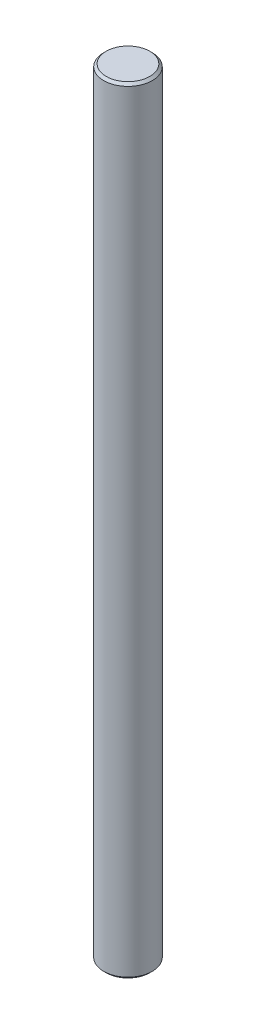
ISO-10303-21;
HEADER;
FILE_DESCRIPTION(('STEP AP214'),'2;1');
FILE_NAME('part.step','',(''),(''),'','','');
FILE_SCHEMA(('AUTOMOTIVE_DESIGN { 1 0 10303 214 1 1 1 1 }'));
ENDSEC;
DATA;
#1=APPLICATION_CONTEXT('core data for automotive mechanical design processes');
#2=APPLICATION_PROTOCOL_DEFINITION('international standard','automotive_design',2000,#1);
#3=PRODUCT_CONTEXT('',#1,'mechanical');
#4=PRODUCT('Part','Part','',(#3));
#5=PRODUCT_RELATED_PRODUCT_CATEGORY('part','',(#4));
#6=PRODUCT_DEFINITION_FORMATION('','',#4);
#7=PRODUCT_DEFINITION_CONTEXT('part definition',#1,'design');
#8=PRODUCT_DEFINITION('design','',#6,#7);
#9=PRODUCT_DEFINITION_SHAPE('','',#8);
#10=(LENGTH_UNIT() NAMED_UNIT(*) SI_UNIT(.MILLI.,.METRE.));
#11=(NAMED_UNIT(*) PLANE_ANGLE_UNIT() SI_UNIT($,.RADIAN.));
#12=(NAMED_UNIT(*) SI_UNIT($,.STERADIAN.) SOLID_ANGLE_UNIT());
#13=UNCERTAINTY_MEASURE_WITH_UNIT(LENGTH_MEASURE(1.E-05),#10,'distance_accuracy_value','');
#14=(GEOMETRIC_REPRESENTATION_CONTEXT(3) GLOBAL_UNCERTAINTY_ASSIGNED_CONTEXT((#13)) GLOBAL_UNIT_ASSIGNED_CONTEXT((#10,
#11,#12)) REPRESENTATION_CONTEXT('',''));
#15=CARTESIAN_POINT('',(0.,0.,0.));
#16=DIRECTION('',(0.,0.,1.));
#17=DIRECTION('',(1.,0.,0.));
#18=AXIS2_PLACEMENT_3D('',#15,#16,#17);
#19=CARTESIAN_POINT('',(0.,40.,0.));
#20=DIRECTION('',(0.,-1.,0.));
#21=DIRECTION('',(0.,0.,-1.));
#22=AXIS2_PLACEMENT_3D('',#19,#20,#21);
#23=CYLINDRICAL_SURFACE('',#22,2.5);
#24=CARTESIAN_POINT('',(0.,-39.75,0.));
#25=DIRECTION('',(0.,1.,0.));
#26=DIRECTION('',(0.,0.,1.));
#27=AXIS2_PLACEMENT_3D('',#24,#25,#26);
#28=CIRCLE('',#27,2.5);
#29=CARTESIAN_POINT('',(0.,-39.75,2.5));
#30=VERTEX_POINT('',#29);
#31=EDGE_CURVE('E48',#30,#30,#28,.T.);
#32=ORIENTED_EDGE('',*,*,#31,.T.);
#33=EDGE_LOOP('',(#32));
#34=FACE_BOUND('',#33,.T.);
#35=CARTESIAN_POINT('',(0.,39.75,0.));
#36=DIRECTION('',(0.,1.,0.));
#37=DIRECTION('',(0.,0.,1.));
#38=AXIS2_PLACEMENT_3D('',#35,#36,#37);
#39=CIRCLE('',#38,2.5);
#40=CARTESIAN_POINT('',(0.,39.75,2.5));
#41=VERTEX_POINT('',#40);
#42=EDGE_CURVE('E52',#41,#41,#39,.F.);
#43=ORIENTED_EDGE('',*,*,#42,.T.);
#44=EDGE_LOOP('',(#43));
#45=FACE_BOUND('',#44,.T.);
#46=ADVANCED_FACE('F36',(#34,#45),#23,.T.);
#47=CARTESIAN_POINT('',(0.,40.,0.));
#48=DIRECTION('',(0.,1.,0.));
#49=DIRECTION('',(0.,0.,1.));
#50=AXIS2_PLACEMENT_3D('',#47,#48,#49);
#51=PLANE('',#50);
#52=CARTESIAN_POINT('',(0.,40.,0.));
#53=DIRECTION('',(0.,1.,0.));
#54=DIRECTION('',(0.,0.,1.));
#55=AXIS2_PLACEMENT_3D('',#52,#53,#54);
#56=CIRCLE('',#55,2.25000000000001);
#57=CARTESIAN_POINT('',(0.,40.,2.25000000000001));
#58=VERTEX_POINT('',#57);
#59=EDGE_CURVE('E10',#58,#58,#56,.T.);
#60=ORIENTED_EDGE('',*,*,#59,.T.);
#61=EDGE_LOOP('',(#60));
#62=FACE_BOUND('',#61,.T.);
#63=ADVANCED_FACE('F68',(#62),#51,.T.);
#64=CARTESIAN_POINT('',(0.,-40.,0.));
#65=DIRECTION('',(0.,1.,0.));
#66=DIRECTION('',(0.,0.,1.));
#67=AXIS2_PLACEMENT_3D('',#64,#65,#66);
#68=PLANE('',#67);
#69=CARTESIAN_POINT('',(0.,-40.,0.));
#70=DIRECTION('',(0.,1.,0.));
#71=DIRECTION('',(0.,0.,1.));
#72=AXIS2_PLACEMENT_3D('',#69,#70,#71);
#73=CIRCLE('',#72,2.25);
#74=CARTESIAN_POINT('',(0.,-40.,2.25));
#75=VERTEX_POINT('',#74);
#76=EDGE_CURVE('E44',#75,#75,#73,.F.);
#77=ORIENTED_EDGE('',*,*,#76,.T.);
#78=EDGE_LOOP('',(#77));
#79=FACE_BOUND('',#78,.T.);
#80=ADVANCED_FACE('F65',(#79),#68,.F.);
#81=CARTESIAN_POINT('',(0.,-39.75,0.));
#82=DIRECTION('',(0.,1.,0.));
#83=DIRECTION('',(0.,0.,1.));
#84=AXIS2_PLACEMENT_3D('',#81,#82,#83);
#85=CONICAL_SURFACE('',#84,2.5,0.785398163397443);
#86=ORIENTED_EDGE('',*,*,#76,.F.);
#87=EDGE_LOOP('',(#86));
#88=FACE_BOUND('',#87,.T.);
#89=ORIENTED_EDGE('',*,*,#31,.F.);
#90=EDGE_LOOP('',(#89));
#91=FACE_BOUND('',#90,.T.);
#92=ADVANCED_FACE('F61',(#88,#91),#85,.T.);
#93=CARTESIAN_POINT('',(0.,40.,0.));
#94=DIRECTION('',(0.,-1.,0.));
#95=DIRECTION('',(0.,0.,-1.));
#96=AXIS2_PLACEMENT_3D('',#93,#94,#95);
#97=CONICAL_SURFACE('',#96,2.25000000000001,0.785398163397443);
#98=ORIENTED_EDGE('',*,*,#42,.F.);
#99=EDGE_LOOP('',(#98));
#100=FACE_BOUND('',#99,.T.);
#101=ORIENTED_EDGE('',*,*,#59,.F.);
#102=EDGE_LOOP('',(#101));
#103=FACE_BOUND('',#102,.T.);
#104=ADVANCED_FACE('F39',(#100,#103),#97,.T.);
#105=CLOSED_SHELL('',(#46,#63,#80,#92,#104));
#106=MANIFOLD_SOLID_BREP('B2',#105);
#107=ADVANCED_BREP_SHAPE_REPRESENTATION('',(#18,#106),#14);
#108=SHAPE_DEFINITION_REPRESENTATION(#9,#107);
ENDSEC;
END-ISO-10303-21;
